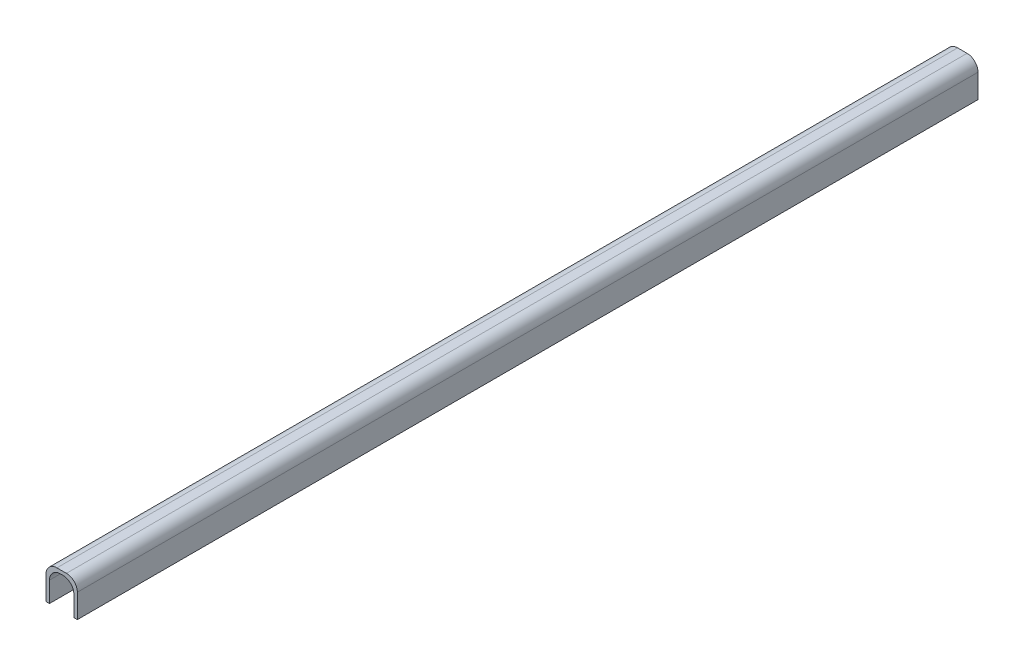
ISO-10303-21;
HEADER;
FILE_DESCRIPTION(('STEP AP214'),'2;1');
FILE_NAME('part.step','',(''),(''),'','','');
FILE_SCHEMA(('AUTOMOTIVE_DESIGN { 1 0 10303 214 1 1 1 1 }'));
ENDSEC;
DATA;
#1=APPLICATION_CONTEXT('core data for automotive mechanical design processes');
#2=APPLICATION_PROTOCOL_DEFINITION('international standard','automotive_design',2000,#1);
#3=PRODUCT_CONTEXT('',#1,'mechanical');
#4=PRODUCT('Part','Part','',(#3));
#5=PRODUCT_RELATED_PRODUCT_CATEGORY('part','',(#4));
#6=PRODUCT_DEFINITION_FORMATION('','',#4);
#7=PRODUCT_DEFINITION_CONTEXT('part definition',#1,'design');
#8=PRODUCT_DEFINITION('design','',#6,#7);
#9=PRODUCT_DEFINITION_SHAPE('','',#8);
#10=(LENGTH_UNIT() NAMED_UNIT(*) SI_UNIT(.MILLI.,.METRE.));
#11=(NAMED_UNIT(*) PLANE_ANGLE_UNIT() SI_UNIT($,.RADIAN.));
#12=(NAMED_UNIT(*) SI_UNIT($,.STERADIAN.) SOLID_ANGLE_UNIT());
#13=UNCERTAINTY_MEASURE_WITH_UNIT(LENGTH_MEASURE(1.E-05),#10,'distance_accuracy_value','');
#14=(GEOMETRIC_REPRESENTATION_CONTEXT(3) GLOBAL_UNCERTAINTY_ASSIGNED_CONTEXT((#13)) GLOBAL_UNIT_ASSIGNED_CONTEXT((#10,
#11,#12)) REPRESENTATION_CONTEXT('',''));
#15=CARTESIAN_POINT('',(0.,0.,0.));
#16=DIRECTION('',(0.,0.,1.));
#17=DIRECTION('',(1.,0.,0.));
#18=AXIS2_PLACEMENT_3D('',#15,#16,#17);
#19=CARTESIAN_POINT('',(0.,0.,825.));
#20=DIRECTION('',(0.,1.,0.));
#21=DIRECTION('',(0.,0.,1.));
#22=AXIS2_PLACEMENT_3D('',#19,#20,#21);
#23=PLANE('',#22);
#24=DIRECTION('',(1.,0.,0.));
#25=VECTOR('',#24,1.);
#26=CARTESIAN_POINT('',(0.,0.,0.));
#27=LINE('',#26,#25);
#28=CARTESIAN_POINT('',(0.,0.,0.));
#29=VERTEX_POINT('',#28);
#30=CARTESIAN_POINT('',(3.175,0.,0.));
#31=VERTEX_POINT('',#30);
#32=EDGE_CURVE('E153',#29,#31,#27,.T.);
#33=ORIENTED_EDGE('',*,*,#32,.T.);
#34=DIRECTION('',(0.,0.,-1.));
#35=VECTOR('',#34,1.);
#36=CARTESIAN_POINT('',(3.175,0.,825.));
#37=LINE('',#36,#35);
#38=CARTESIAN_POINT('',(3.175,0.,825.));
#39=VERTEX_POINT('',#38);
#40=EDGE_CURVE('E11',#39,#31,#37,.T.);
#41=ORIENTED_EDGE('',*,*,#40,.F.);
#42=DIRECTION('',(1.,0.,0.));
#43=VECTOR('',#42,1.);
#44=CARTESIAN_POINT('',(0.,0.,825.));
#45=LINE('',#44,#43);
#46=CARTESIAN_POINT('',(0.,0.,825.));
#47=VERTEX_POINT('',#46);
#48=EDGE_CURVE('E175',#47,#39,#45,.T.);
#49=ORIENTED_EDGE('',*,*,#48,.F.);
#50=DIRECTION('',(0.,0.,-1.));
#51=VECTOR('',#50,1.);
#52=CARTESIAN_POINT('',(0.,0.,825.));
#53=LINE('',#52,#51);
#54=EDGE_CURVE('E149',#47,#29,#53,.T.);
#55=ORIENTED_EDGE('',*,*,#54,.T.);
#56=EDGE_LOOP('',(#33,#41,#49,#55));
#57=FACE_BOUND('',#56,.T.);
#58=ADVANCED_FACE('F33',(#57),#23,.F.);
#59=CARTESIAN_POINT('',(3.175,0.,825.));
#60=DIRECTION('',(-1.,0.,0.));
#61=DIRECTION('',(0.,0.,1.));
#62=AXIS2_PLACEMENT_3D('',#59,#60,#61);
#63=PLANE('',#62);
#64=DIRECTION('',(0.,1.,0.));
#65=VECTOR('',#64,1.);
#66=CARTESIAN_POINT('',(3.175,0.,0.));
#67=LINE('',#66,#65);
#68=CARTESIAN_POINT('',(3.175,18.5749999999999,0.));
#69=VERTEX_POINT('',#68);
#70=EDGE_CURVE('E156',#31,#69,#67,.T.);
#71=ORIENTED_EDGE('',*,*,#70,.T.);
#72=DIRECTION('',(0.,0.,-1.));
#73=VECTOR('',#72,1.);
#74=CARTESIAN_POINT('',(3.175,18.5749999999999,825.));
#75=LINE('',#74,#73);
#76=CARTESIAN_POINT('',(3.175,18.5749999999999,825.));
#77=VERTEX_POINT('',#76);
#78=EDGE_CURVE('E41',#77,#69,#75,.T.);
#79=ORIENTED_EDGE('',*,*,#78,.F.);
#80=DIRECTION('',(0.,1.,0.));
#81=VECTOR('',#80,1.);
#82=CARTESIAN_POINT('',(3.175,0.,825.));
#83=LINE('',#82,#81);
#84=EDGE_CURVE('E104',#39,#77,#83,.T.);
#85=ORIENTED_EDGE('',*,*,#84,.F.);
#86=ORIENTED_EDGE('',*,*,#40,.T.);
#87=EDGE_LOOP('',(#71,#79,#85,#86));
#88=FACE_BOUND('',#87,.T.);
#89=ADVANCED_FACE('F253',(#88),#63,.F.);
#90=CARTESIAN_POINT('',(13.175,18.575,825.));
#91=DIRECTION('',(0.,0.,-1.));
#92=DIRECTION('',(-1.,0.,0.));
#93=AXIS2_PLACEMENT_3D('',#90,#91,#92);
#94=CYLINDRICAL_SURFACE('',#93,10.);
#95=CARTESIAN_POINT('',(13.175,18.575,0.));
#96=DIRECTION('',(0.,0.,-1.));
#97=DIRECTION('',(-1.,0.,0.));
#98=AXIS2_PLACEMENT_3D('',#95,#96,#97);
#99=CIRCLE('',#98,10.);
#100=CARTESIAN_POINT('',(13.1750000000001,28.575,0.));
#101=VERTEX_POINT('',#100);
#102=EDGE_CURVE('E158',#69,#101,#99,.T.);
#103=ORIENTED_EDGE('',*,*,#102,.T.);
#104=DIRECTION('',(0.,0.,-1.));
#105=VECTOR('',#104,1.);
#106=CARTESIAN_POINT('',(13.1750000000001,28.575,825.));
#107=LINE('',#106,#105);
#108=CARTESIAN_POINT('',(13.1750000000001,28.575,825.));
#109=VERTEX_POINT('',#108);
#110=EDGE_CURVE('E194',#109,#101,#107,.T.);
#111=ORIENTED_EDGE('',*,*,#110,.F.);
#112=CARTESIAN_POINT('',(13.175,18.575,825.));
#113=DIRECTION('',(0.,0.,-1.));
#114=DIRECTION('',(-1.,0.,0.));
#115=AXIS2_PLACEMENT_3D('',#112,#113,#114);
#116=CIRCLE('',#115,10.);
#117=EDGE_CURVE('E202',#77,#109,#116,.T.);
#118=ORIENTED_EDGE('',*,*,#117,.F.);
#119=ORIENTED_EDGE('',*,*,#78,.T.);
#120=EDGE_LOOP('',(#103,#111,#118,#119));
#121=FACE_BOUND('',#120,.T.);
#122=ADVANCED_FACE('F200',(#121),#94,.F.);
#123=CARTESIAN_POINT('',(13.1750000000001,28.575,825.));
#124=DIRECTION('',(0.,1.,0.));
#125=DIRECTION('',(0.,0.,1.));
#126=AXIS2_PLACEMENT_3D('',#123,#124,#125);
#127=PLANE('',#126);
#128=DIRECTION('',(1.,0.,0.));
#129=VECTOR('',#128,1.);
#130=CARTESIAN_POINT('',(13.1750000000001,28.575,0.));
#131=LINE('',#130,#129);
#132=CARTESIAN_POINT('',(15.5269999999999,28.575,0.));
#133=VERTEX_POINT('',#132);
#134=EDGE_CURVE('E160',#101,#133,#131,.T.);
#135=ORIENTED_EDGE('',*,*,#134,.T.);
#136=DIRECTION('',(0.,0.,-1.));
#137=VECTOR('',#136,1.);
#138=CARTESIAN_POINT('',(15.5269999999999,28.575,825.));
#139=LINE('',#138,#137);
#140=CARTESIAN_POINT('',(15.5269999999999,28.575,825.));
#141=VERTEX_POINT('',#140);
#142=EDGE_CURVE('E191',#141,#133,#139,.T.);
#143=ORIENTED_EDGE('',*,*,#142,.F.);
#144=DIRECTION('',(1.,0.,0.));
#145=VECTOR('',#144,1.);
#146=CARTESIAN_POINT('',(13.1750000000001,28.575,825.));
#147=LINE('',#146,#145);
#148=EDGE_CURVE('E220',#109,#141,#147,.T.);
#149=ORIENTED_EDGE('',*,*,#148,.F.);
#150=ORIENTED_EDGE('',*,*,#110,.T.);
#151=EDGE_LOOP('',(#135,#143,#149,#150));
#152=FACE_BOUND('',#151,.T.);
#153=ADVANCED_FACE('F211',(#152),#127,.F.);
#154=CARTESIAN_POINT('',(15.527,18.575,825.));
#155=DIRECTION('',(0.,0.,-1.));
#156=DIRECTION('',(-1.,0.,0.));
#157=AXIS2_PLACEMENT_3D('',#154,#155,#156);
#158=CYLINDRICAL_SURFACE('',#157,10.);
#159=CARTESIAN_POINT('',(15.527,18.575,0.));
#160=DIRECTION('',(0.,0.,-1.));
#161=DIRECTION('',(-1.,0.,0.));
#162=AXIS2_PLACEMENT_3D('',#159,#160,#161);
#163=CIRCLE('',#162,10.);
#164=CARTESIAN_POINT('',(25.527,18.5749999999999,0.));
#165=VERTEX_POINT('',#164);
#166=EDGE_CURVE('E162',#133,#165,#163,.T.);
#167=ORIENTED_EDGE('',*,*,#166,.T.);
#168=DIRECTION('',(0.,0.,-1.));
#169=VECTOR('',#168,1.);
#170=CARTESIAN_POINT('',(25.527,18.5749999999999,825.));
#171=LINE('',#170,#169);
#172=CARTESIAN_POINT('',(25.527,18.5749999999999,825.));
#173=VERTEX_POINT('',#172);
#174=EDGE_CURVE('E188',#173,#165,#171,.T.);
#175=ORIENTED_EDGE('',*,*,#174,.F.);
#176=CARTESIAN_POINT('',(15.527,18.575,825.));
#177=DIRECTION('',(0.,0.,-1.));
#178=DIRECTION('',(-1.,0.,0.));
#179=AXIS2_PLACEMENT_3D('',#176,#177,#178);
#180=CIRCLE('',#179,10.);
#181=EDGE_CURVE('E217',#141,#173,#180,.T.);
#182=ORIENTED_EDGE('',*,*,#181,.F.);
#183=ORIENTED_EDGE('',*,*,#142,.T.);
#184=EDGE_LOOP('',(#167,#175,#182,#183));
#185=FACE_BOUND('',#184,.T.);
#186=ADVANCED_FACE('F215',(#185),#158,.F.);
#187=CARTESIAN_POINT('',(25.527,0.,825.));
#188=DIRECTION('',(1.,0.,0.));
#189=DIRECTION('',(0.,0.,-1.));
#190=AXIS2_PLACEMENT_3D('',#187,#188,#189);
#191=PLANE('',#190);
#192=DIRECTION('',(0.,-1.,0.));
#193=VECTOR('',#192,1.);
#194=CARTESIAN_POINT('',(25.527,0.,0.));
#195=LINE('',#194,#193);
#196=CARTESIAN_POINT('',(25.527,0.,0.));
#197=VERTEX_POINT('',#196);
#198=EDGE_CURVE('E164',#165,#197,#195,.T.);
#199=ORIENTED_EDGE('',*,*,#198,.T.);
#200=DIRECTION('',(0.,0.,-1.));
#201=VECTOR('',#200,1.);
#202=CARTESIAN_POINT('',(25.527,0.,825.));
#203=LINE('',#202,#201);
#204=CARTESIAN_POINT('',(25.527,0.,825.));
#205=VERTEX_POINT('',#204);
#206=EDGE_CURVE('E185',#205,#197,#203,.T.);
#207=ORIENTED_EDGE('',*,*,#206,.F.);
#208=DIRECTION('',(0.,-1.,0.));
#209=VECTOR('',#208,1.);
#210=CARTESIAN_POINT('',(25.527,0.,825.));
#211=LINE('',#210,#209);
#212=EDGE_CURVE('E219',#173,#205,#211,.T.);
#213=ORIENTED_EDGE('',*,*,#212,.F.);
#214=ORIENTED_EDGE('',*,*,#174,.T.);
#215=EDGE_LOOP('',(#199,#207,#213,#214));
#216=FACE_BOUND('',#215,.T.);
#217=ADVANCED_FACE('F266',(#216),#191,.F.);
#218=CARTESIAN_POINT('',(28.702,0.,825.));
#219=DIRECTION('',(0.,1.,0.));
#220=DIRECTION('',(0.,0.,1.));
#221=AXIS2_PLACEMENT_3D('',#218,#219,#220);
#222=PLANE('',#221);
#223=DIRECTION('',(1.,0.,0.));
#224=VECTOR('',#223,1.);
#225=CARTESIAN_POINT('',(28.702,0.,0.));
#226=LINE('',#225,#224);
#227=CARTESIAN_POINT('',(28.702,0.,0.));
#228=VERTEX_POINT('',#227);
#229=EDGE_CURVE('E166',#197,#228,#226,.T.);
#230=ORIENTED_EDGE('',*,*,#229,.T.);
#231=DIRECTION('',(0.,0.,-1.));
#232=VECTOR('',#231,1.);
#233=CARTESIAN_POINT('',(28.702,0.,825.));
#234=LINE('',#233,#232);
#235=CARTESIAN_POINT('',(28.702,0.,825.));
#236=VERTEX_POINT('',#235);
#237=EDGE_CURVE('E182',#236,#228,#234,.T.);
#238=ORIENTED_EDGE('',*,*,#237,.F.);
#239=DIRECTION('',(1.,0.,0.));
#240=VECTOR('',#239,1.);
#241=CARTESIAN_POINT('',(28.702,0.,825.));
#242=LINE('',#241,#240);
#243=EDGE_CURVE('E222',#205,#236,#242,.T.);
#244=ORIENTED_EDGE('',*,*,#243,.F.);
#245=ORIENTED_EDGE('',*,*,#206,.T.);
#246=EDGE_LOOP('',(#230,#238,#244,#245));
#247=FACE_BOUND('',#246,.T.);
#248=ADVANCED_FACE('F269',(#247),#222,.F.);
#249=CARTESIAN_POINT('',(28.702,0.,825.));
#250=DIRECTION('',(-1.,0.,0.));
#251=DIRECTION('',(0.,0.,1.));
#252=AXIS2_PLACEMENT_3D('',#249,#250,#251);
#253=PLANE('',#252);
#254=DIRECTION('',(0.,1.,0.));
#255=VECTOR('',#254,1.);
#256=CARTESIAN_POINT('',(28.702,0.,0.));
#257=LINE('',#256,#255);
#258=CARTESIAN_POINT('',(28.702,21.7499999999999,0.));
#259=VERTEX_POINT('',#258);
#260=EDGE_CURVE('E168',#228,#259,#257,.T.);
#261=ORIENTED_EDGE('',*,*,#260,.T.);
#262=DIRECTION('',(0.,0.,-1.));
#263=VECTOR('',#262,1.);
#264=CARTESIAN_POINT('',(28.702,21.7499999999999,825.));
#265=LINE('',#264,#263);
#266=CARTESIAN_POINT('',(28.702,21.7499999999999,825.));
#267=VERTEX_POINT('',#266);
#268=EDGE_CURVE('E179',#267,#259,#265,.T.);
#269=ORIENTED_EDGE('',*,*,#268,.F.);
#270=DIRECTION('',(0.,1.,0.));
#271=VECTOR('',#270,1.);
#272=CARTESIAN_POINT('',(28.702,0.,825.));
#273=LINE('',#272,#271);
#274=EDGE_CURVE('E228',#236,#267,#273,.T.);
#275=ORIENTED_EDGE('',*,*,#274,.F.);
#276=ORIENTED_EDGE('',*,*,#237,.T.);
#277=EDGE_LOOP('',(#261,#269,#275,#276));
#278=FACE_BOUND('',#277,.T.);
#279=ADVANCED_FACE('F234',(#278),#253,.F.);
#280=CARTESIAN_POINT('',(18.702,21.75,825.));
#281=DIRECTION('',(0.,0.,-1.));
#282=DIRECTION('',(-1.,0.,0.));
#283=AXIS2_PLACEMENT_3D('',#280,#281,#282);
#284=CYLINDRICAL_SURFACE('',#283,10.);
#285=CARTESIAN_POINT('',(18.702,21.75,0.));
#286=DIRECTION('',(0.,0.,1.));
#287=DIRECTION('',(1.,0.,0.));
#288=AXIS2_PLACEMENT_3D('',#285,#286,#287);
#289=CIRCLE('',#288,10.);
#290=CARTESIAN_POINT('',(18.7019999999999,31.75,0.));
#291=VERTEX_POINT('',#290);
#292=EDGE_CURVE('E170',#259,#291,#289,.T.);
#293=ORIENTED_EDGE('',*,*,#292,.T.);
#294=DIRECTION('',(0.,0.,-1.));
#295=VECTOR('',#294,1.);
#296=CARTESIAN_POINT('',(18.7019999999999,31.75,825.));
#297=LINE('',#296,#295);
#298=CARTESIAN_POINT('',(18.7019999999999,31.75,825.));
#299=VERTEX_POINT('',#298);
#300=EDGE_CURVE('E144',#299,#291,#297,.T.);
#301=ORIENTED_EDGE('',*,*,#300,.F.);
#302=CARTESIAN_POINT('',(18.702,21.75,825.));
#303=DIRECTION('',(0.,0.,1.));
#304=DIRECTION('',(1.,0.,0.));
#305=AXIS2_PLACEMENT_3D('',#302,#303,#304);
#306=CIRCLE('',#305,10.);
#307=EDGE_CURVE('E135',#267,#299,#306,.T.);
#308=ORIENTED_EDGE('',*,*,#307,.F.);
#309=ORIENTED_EDGE('',*,*,#268,.T.);
#310=EDGE_LOOP('',(#293,#301,#308,#309));
#311=FACE_BOUND('',#310,.T.);
#312=ADVANCED_FACE('F238',(#311),#284,.T.);
#313=CARTESIAN_POINT('',(10.0000000000001,31.75,825.));
#314=DIRECTION('',(0.,-1.,0.));
#315=DIRECTION('',(0.,0.,-1.));
#316=AXIS2_PLACEMENT_3D('',#313,#314,#315);
#317=PLANE('',#316);
#318=DIRECTION('',(-1.,0.,0.));
#319=VECTOR('',#318,1.);
#320=CARTESIAN_POINT('',(10.0000000000001,31.75,0.));
#321=LINE('',#320,#319);
#322=CARTESIAN_POINT('',(10.0000000000001,31.75,0.));
#323=VERTEX_POINT('',#322);
#324=EDGE_CURVE('E143',#291,#323,#321,.T.);
#325=ORIENTED_EDGE('',*,*,#324,.T.);
#326=DIRECTION('',(0.,0.,-1.));
#327=VECTOR('',#326,1.);
#328=CARTESIAN_POINT('',(10.0000000000001,31.75,825.));
#329=LINE('',#328,#327);
#330=CARTESIAN_POINT('',(10.0000000000001,31.75,825.));
#331=VERTEX_POINT('',#330);
#332=EDGE_CURVE('E140',#331,#323,#329,.T.);
#333=ORIENTED_EDGE('',*,*,#332,.F.);
#334=DIRECTION('',(-1.,0.,0.));
#335=VECTOR('',#334,1.);
#336=CARTESIAN_POINT('',(10.0000000000001,31.75,825.));
#337=LINE('',#336,#335);
#338=EDGE_CURVE('E129',#299,#331,#337,.T.);
#339=ORIENTED_EDGE('',*,*,#338,.F.);
#340=ORIENTED_EDGE('',*,*,#300,.T.);
#341=EDGE_LOOP('',(#325,#333,#339,#340));
#342=FACE_BOUND('',#341,.T.);
#343=ADVANCED_FACE('F141',(#342),#317,.F.);
#344=CARTESIAN_POINT('',(10.,21.75,825.));
#345=DIRECTION('',(0.,0.,-1.));
#346=DIRECTION('',(-1.,0.,0.));
#347=AXIS2_PLACEMENT_3D('',#344,#345,#346);
#348=CYLINDRICAL_SURFACE('',#347,10.);
#349=CARTESIAN_POINT('',(10.,21.75,0.));
#350=DIRECTION('',(0.,0.,1.));
#351=DIRECTION('',(-1.,0.,0.));
#352=AXIS2_PLACEMENT_3D('',#349,#350,#351);
#353=CIRCLE('',#352,10.);
#354=CARTESIAN_POINT('',(0.,21.7499999999999,0.));
#355=VERTEX_POINT('',#354);
#356=EDGE_CURVE('E90',#323,#355,#353,.T.);
#357=ORIENTED_EDGE('',*,*,#356,.T.);
#358=DIRECTION('',(0.,0.,-1.));
#359=VECTOR('',#358,1.);
#360=CARTESIAN_POINT('',(0.,21.7499999999999,825.));
#361=LINE('',#360,#359);
#362=CARTESIAN_POINT('',(0.,21.7499999999999,825.));
#363=VERTEX_POINT('',#362);
#364=EDGE_CURVE('E145',#363,#355,#361,.T.);
#365=ORIENTED_EDGE('',*,*,#364,.F.);
#366=CARTESIAN_POINT('',(10.,21.75,825.));
#367=DIRECTION('',(0.,0.,1.));
#368=DIRECTION('',(-1.,0.,0.));
#369=AXIS2_PLACEMENT_3D('',#366,#367,#368);
#370=CIRCLE('',#369,10.);
#371=EDGE_CURVE('E133',#331,#363,#370,.T.);
#372=ORIENTED_EDGE('',*,*,#371,.F.);
#373=ORIENTED_EDGE('',*,*,#332,.T.);
#374=EDGE_LOOP('',(#357,#365,#372,#373));
#375=FACE_BOUND('',#374,.T.);
#376=ADVANCED_FACE('F147',(#375),#348,.T.);
#377=CARTESIAN_POINT('',(0.,0.,825.));
#378=DIRECTION('',(1.,0.,0.));
#379=DIRECTION('',(0.,0.,-1.));
#380=AXIS2_PLACEMENT_3D('',#377,#378,#379);
#381=PLANE('',#380);
#382=DIRECTION('',(0.,-1.,0.));
#383=VECTOR('',#382,1.);
#384=CARTESIAN_POINT('',(0.,0.,0.));
#385=LINE('',#384,#383);
#386=EDGE_CURVE('E96',#355,#29,#385,.T.);
#387=ORIENTED_EDGE('',*,*,#386,.T.);
#388=ORIENTED_EDGE('',*,*,#54,.F.);
#389=DIRECTION('',(0.,-1.,0.));
#390=VECTOR('',#389,1.);
#391=CARTESIAN_POINT('',(0.,0.,825.));
#392=LINE('',#391,#390);
#393=EDGE_CURVE('E49',#363,#47,#392,.T.);
#394=ORIENTED_EDGE('',*,*,#393,.F.);
#395=ORIENTED_EDGE('',*,*,#364,.T.);
#396=EDGE_LOOP('',(#387,#388,#394,#395));
#397=FACE_BOUND('',#396,.T.);
#398=ADVANCED_FACE('F242',(#397),#381,.F.);
#399=CARTESIAN_POINT('',(13.175,18.575,825.));
#400=DIRECTION('',(0.,0.,-1.));
#401=DIRECTION('',(-1.,0.,0.));
#402=AXIS2_PLACEMENT_3D('',#399,#400,#401);
#403=PLANE('',#402);
#404=ORIENTED_EDGE('',*,*,#48,.T.);
#405=ORIENTED_EDGE('',*,*,#84,.T.);
#406=ORIENTED_EDGE('',*,*,#117,.T.);
#407=ORIENTED_EDGE('',*,*,#148,.T.);
#408=ORIENTED_EDGE('',*,*,#181,.T.);
#409=ORIENTED_EDGE('',*,*,#212,.T.);
#410=ORIENTED_EDGE('',*,*,#243,.T.);
#411=ORIENTED_EDGE('',*,*,#274,.T.);
#412=ORIENTED_EDGE('',*,*,#307,.T.);
#413=ORIENTED_EDGE('',*,*,#338,.T.);
#414=ORIENTED_EDGE('',*,*,#371,.T.);
#415=ORIENTED_EDGE('',*,*,#393,.T.);
#416=EDGE_LOOP('',(#404,#405,#406,#407,#408,#409,#410,#411,#412,#413,#414,#415));
#417=FACE_BOUND('',#416,.T.);
#418=ADVANCED_FACE('F131',(#417),#403,.F.);
#419=CARTESIAN_POINT('',(13.175,18.575,0.));
#420=DIRECTION('',(0.,0.,-1.));
#421=DIRECTION('',(-1.,0.,0.));
#422=AXIS2_PLACEMENT_3D('',#419,#420,#421);
#423=PLANE('',#422);
#424=ORIENTED_EDGE('',*,*,#32,.F.);
#425=ORIENTED_EDGE('',*,*,#386,.F.);
#426=ORIENTED_EDGE('',*,*,#356,.F.);
#427=ORIENTED_EDGE('',*,*,#324,.F.);
#428=ORIENTED_EDGE('',*,*,#292,.F.);
#429=ORIENTED_EDGE('',*,*,#260,.F.);
#430=ORIENTED_EDGE('',*,*,#229,.F.);
#431=ORIENTED_EDGE('',*,*,#198,.F.);
#432=ORIENTED_EDGE('',*,*,#166,.F.);
#433=ORIENTED_EDGE('',*,*,#134,.F.);
#434=ORIENTED_EDGE('',*,*,#102,.F.);
#435=ORIENTED_EDGE('',*,*,#70,.F.);
#436=EDGE_LOOP('',(#424,#425,#426,#427,#428,#429,#430,#431,#432,#433,#434,#435));
#437=FACE_BOUND('',#436,.T.);
#438=ADVANCED_FACE('F206',(#437),#423,.T.);
#439=CLOSED_SHELL('',(#58,#89,#122,#153,#186,#217,#248,#279,#312,#343,#376,#398,#418,#438));
#440=MANIFOLD_SOLID_BREP('B2',#439);
#441=ADVANCED_BREP_SHAPE_REPRESENTATION('',(#18,#440),#14);
#442=SHAPE_DEFINITION_REPRESENTATION(#9,#441);
ENDSEC;
END-ISO-10303-21;
